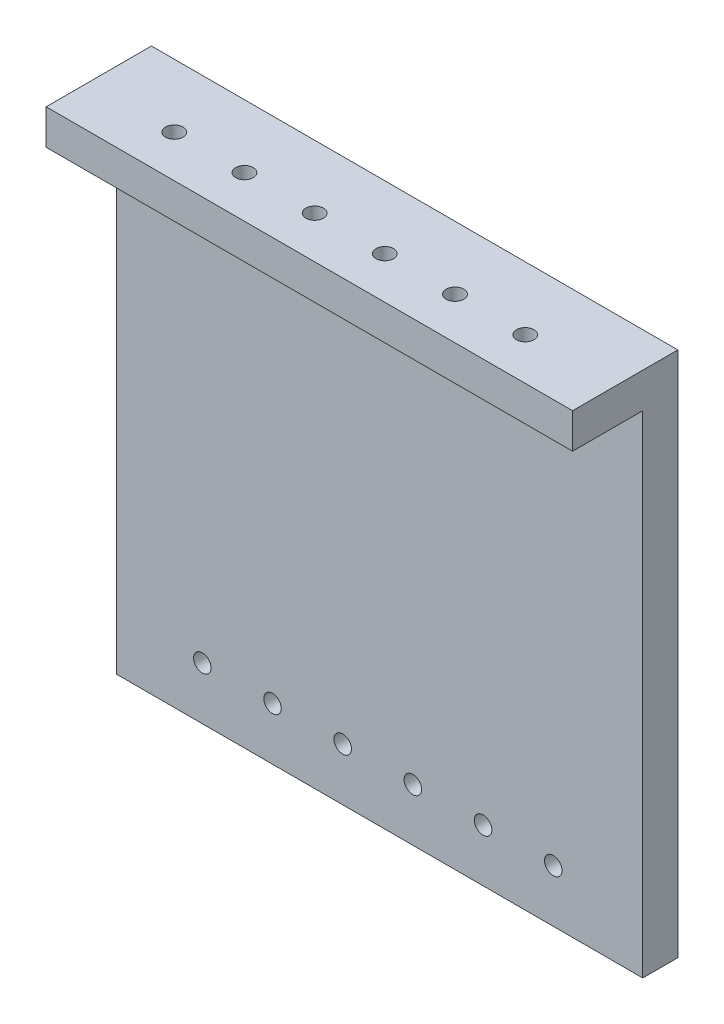
ISO-10303-21;
HEADER;
FILE_DESCRIPTION(('STEP AP214'),'2;1');
FILE_NAME('part.step','',(''),(''),'','','');
FILE_SCHEMA(('AUTOMOTIVE_DESIGN { 1 0 10303 214 1 1 1 1 }'));
ENDSEC;
DATA;
#1=APPLICATION_CONTEXT('core data for automotive mechanical design processes');
#2=APPLICATION_PROTOCOL_DEFINITION('international standard','automotive_design',2000,#1);
#3=PRODUCT_CONTEXT('',#1,'mechanical');
#4=PRODUCT('Part','Part','',(#3));
#5=PRODUCT_RELATED_PRODUCT_CATEGORY('part','',(#4));
#6=PRODUCT_DEFINITION_FORMATION('','',#4);
#7=PRODUCT_DEFINITION_CONTEXT('part definition',#1,'design');
#8=PRODUCT_DEFINITION('design','',#6,#7);
#9=PRODUCT_DEFINITION_SHAPE('','',#8);
#10=(LENGTH_UNIT() NAMED_UNIT(*) SI_UNIT(.MILLI.,.METRE.));
#11=(NAMED_UNIT(*) PLANE_ANGLE_UNIT() SI_UNIT($,.RADIAN.));
#12=(NAMED_UNIT(*) SI_UNIT($,.STERADIAN.) SOLID_ANGLE_UNIT());
#13=UNCERTAINTY_MEASURE_WITH_UNIT(LENGTH_MEASURE(1.E-05),#10,'distance_accuracy_value','');
#14=(GEOMETRIC_REPRESENTATION_CONTEXT(3) GLOBAL_UNCERTAINTY_ASSIGNED_CONTEXT((#13)) GLOBAL_UNIT_ASSIGNED_CONTEXT((#10,
#11,#12)) REPRESENTATION_CONTEXT('',''));
#15=CARTESIAN_POINT('',(0.,0.,0.));
#16=DIRECTION('',(0.,0.,1.));
#17=DIRECTION('',(1.,0.,0.));
#18=AXIS2_PLACEMENT_3D('',#15,#16,#17);
#19=CARTESIAN_POINT('',(0.,0.,5.));
#20=DIRECTION('',(0.,0.,-1.));
#21=DIRECTION('',(-1.,0.,0.));
#22=AXIS2_PLACEMENT_3D('',#19,#20,#21);
#23=PLANE('',#22);
#24=CARTESIAN_POINT('',(24.75,-30.,5.));
#25=DIRECTION('',(0.,0.,1.));
#26=DIRECTION('',(1.,0.,0.));
#27=AXIS2_PLACEMENT_3D('',#24,#25,#26);
#28=CIRCLE('',#27,1.25);
#29=CARTESIAN_POINT('',(26.,-30.,5.));
#30=VERTEX_POINT('',#29);
#31=EDGE_CURVE('E140',#30,#30,#28,.T.);
#32=ORIENTED_EDGE('',*,*,#31,.F.);
#33=EDGE_LOOP('',(#32));
#34=FACE_BOUND('',#33,.T.);
#35=CARTESIAN_POINT('',(14.75,-30.,5.));
#36=DIRECTION('',(0.,0.,1.));
#37=DIRECTION('',(1.,0.,0.));
#38=AXIS2_PLACEMENT_3D('',#35,#36,#37);
#39=CIRCLE('',#38,1.25);
#40=CARTESIAN_POINT('',(16.,-30.,5.));
#41=VERTEX_POINT('',#40);
#42=EDGE_CURVE('E146',#41,#41,#39,.T.);
#43=ORIENTED_EDGE('',*,*,#42,.F.);
#44=EDGE_LOOP('',(#43));
#45=FACE_BOUND('',#44,.T.);
#46=CARTESIAN_POINT('',(4.75000000000001,-30.,5.));
#47=DIRECTION('',(0.,0.,1.));
#48=DIRECTION('',(1.,0.,0.));
#49=AXIS2_PLACEMENT_3D('',#46,#47,#48);
#50=CIRCLE('',#49,1.25);
#51=CARTESIAN_POINT('',(6.00000000000001,-30.,5.));
#52=VERTEX_POINT('',#51);
#53=EDGE_CURVE('E152',#52,#52,#50,.T.);
#54=ORIENTED_EDGE('',*,*,#53,.F.);
#55=EDGE_LOOP('',(#54));
#56=FACE_BOUND('',#55,.T.);
#57=CARTESIAN_POINT('',(-5.24999999999999,-30.,5.));
#58=DIRECTION('',(0.,0.,1.));
#59=DIRECTION('',(1.,0.,0.));
#60=AXIS2_PLACEMENT_3D('',#57,#58,#59);
#61=CIRCLE('',#60,1.25);
#62=CARTESIAN_POINT('',(-3.99999999999999,-30.,5.));
#63=VERTEX_POINT('',#62);
#64=EDGE_CURVE('E158',#63,#63,#61,.T.);
#65=ORIENTED_EDGE('',*,*,#64,.F.);
#66=EDGE_LOOP('',(#65));
#67=FACE_BOUND('',#66,.T.);
#68=CARTESIAN_POINT('',(-15.25,-30.,5.));
#69=DIRECTION('',(0.,0.,1.));
#70=DIRECTION('',(1.,0.,0.));
#71=AXIS2_PLACEMENT_3D('',#68,#69,#70);
#72=CIRCLE('',#71,1.25);
#73=CARTESIAN_POINT('',(-14.,-30.,5.));
#74=VERTEX_POINT('',#73);
#75=EDGE_CURVE('E164',#74,#74,#72,.T.);
#76=ORIENTED_EDGE('',*,*,#75,.F.);
#77=EDGE_LOOP('',(#76));
#78=FACE_BOUND('',#77,.T.);
#79=CARTESIAN_POINT('',(-25.25,-30.,5.));
#80=DIRECTION('',(0.,0.,1.));
#81=DIRECTION('',(1.,0.,0.));
#82=AXIS2_PLACEMENT_3D('',#79,#80,#81);
#83=CIRCLE('',#82,1.25);
#84=CARTESIAN_POINT('',(-24.,-30.,5.));
#85=VERTEX_POINT('',#84);
#86=EDGE_CURVE('E95',#85,#85,#83,.T.);
#87=ORIENTED_EDGE('',*,*,#86,.F.);
#88=EDGE_LOOP('',(#87));
#89=FACE_BOUND('',#88,.T.);
#90=DIRECTION('',(1.,0.,0.));
#91=VECTOR('',#90,1.);
#92=CARTESIAN_POINT('',(-37.5,32.5,5.));
#93=LINE('',#92,#91);
#94=CARTESIAN_POINT('',(-37.5,32.5,5.));
#95=VERTEX_POINT('',#94);
#96=CARTESIAN_POINT('',(37.5,32.5,5.));
#97=VERTEX_POINT('',#96);
#98=EDGE_CURVE('E48',#95,#97,#93,.T.);
#99=ORIENTED_EDGE('',*,*,#98,.F.);
#100=DIRECTION('',(0.,-1.,0.));
#101=VECTOR('',#100,1.);
#102=CARTESIAN_POINT('',(-37.5,-37.5,5.));
#103=LINE('',#102,#101);
#104=CARTESIAN_POINT('',(-37.5,-37.5,5.));
#105=VERTEX_POINT('',#104);
#106=EDGE_CURVE('E171',#95,#105,#103,.T.);
#107=ORIENTED_EDGE('',*,*,#106,.T.);
#108=DIRECTION('',(1.,0.,0.));
#109=VECTOR('',#108,1.);
#110=CARTESIAN_POINT('',(-37.5,-37.5,5.));
#111=LINE('',#110,#109);
#112=CARTESIAN_POINT('',(37.5,-37.5,5.));
#113=VERTEX_POINT('',#112);
#114=EDGE_CURVE('E54',#105,#113,#111,.T.);
#115=ORIENTED_EDGE('',*,*,#114,.T.);
#116=DIRECTION('',(0.,1.,0.));
#117=VECTOR('',#116,1.);
#118=CARTESIAN_POINT('',(37.5,-37.5,5.));
#119=LINE('',#118,#117);
#120=EDGE_CURVE('E83',#113,#97,#119,.T.);
#121=ORIENTED_EDGE('',*,*,#120,.T.);
#122=EDGE_LOOP('',(#99,#107,#115,#121));
#123=FACE_BOUND('',#122,.T.);
#124=ADVANCED_FACE('F33',(#34,#45,#56,#67,#78,#89,#123),#23,.F.);
#125=CARTESIAN_POINT('',(0.,0.,0.));
#126=DIRECTION('',(0.,0.,-1.));
#127=DIRECTION('',(-1.,0.,0.));
#128=AXIS2_PLACEMENT_3D('',#125,#126,#127);
#129=PLANE('',#128);
#130=CARTESIAN_POINT('',(14.75,-30.,0.));
#131=DIRECTION('',(0.,0.,1.));
#132=DIRECTION('',(1.,0.,0.));
#133=AXIS2_PLACEMENT_3D('',#130,#131,#132);
#134=CIRCLE('',#133,1.25);
#135=CARTESIAN_POINT('',(16.,-30.,0.));
#136=VERTEX_POINT('',#135);
#137=EDGE_CURVE('E143',#136,#136,#134,.T.);
#138=ORIENTED_EDGE('',*,*,#137,.T.);
#139=EDGE_LOOP('',(#138));
#140=FACE_BOUND('',#139,.T.);
#141=CARTESIAN_POINT('',(-5.24999999999999,-30.,0.));
#142=DIRECTION('',(0.,0.,1.));
#143=DIRECTION('',(1.,0.,0.));
#144=AXIS2_PLACEMENT_3D('',#141,#142,#143);
#145=CIRCLE('',#144,1.25);
#146=CARTESIAN_POINT('',(-3.99999999999999,-30.,0.));
#147=VERTEX_POINT('',#146);
#148=EDGE_CURVE('E155',#147,#147,#145,.T.);
#149=ORIENTED_EDGE('',*,*,#148,.T.);
#150=EDGE_LOOP('',(#149));
#151=FACE_BOUND('',#150,.T.);
#152=CARTESIAN_POINT('',(-25.25,-30.,0.));
#153=DIRECTION('',(0.,0.,1.));
#154=DIRECTION('',(1.,0.,0.));
#155=AXIS2_PLACEMENT_3D('',#152,#153,#154);
#156=CIRCLE('',#155,1.25);
#157=CARTESIAN_POINT('',(-24.,-30.,0.));
#158=VERTEX_POINT('',#157);
#159=EDGE_CURVE('E99',#158,#158,#156,.T.);
#160=ORIENTED_EDGE('',*,*,#159,.T.);
#161=EDGE_LOOP('',(#160));
#162=FACE_BOUND('',#161,.T.);
#163=DIRECTION('',(0.,1.,0.));
#164=VECTOR('',#163,1.);
#165=CARTESIAN_POINT('',(37.5,-37.5,0.));
#166=LINE('',#165,#164);
#167=CARTESIAN_POINT('',(37.5,-37.5,0.));
#168=VERTEX_POINT('',#167);
#169=CARTESIAN_POINT('',(37.5,37.5,0.));
#170=VERTEX_POINT('',#169);
#171=EDGE_CURVE('E89',#168,#170,#166,.T.);
#172=ORIENTED_EDGE('',*,*,#171,.F.);
#173=DIRECTION('',(1.,0.,0.));
#174=VECTOR('',#173,1.);
#175=CARTESIAN_POINT('',(-37.5,-37.5,0.));
#176=LINE('',#175,#174);
#177=CARTESIAN_POINT('',(-37.5,-37.5,0.));
#178=VERTEX_POINT('',#177);
#179=EDGE_CURVE('E73',#178,#168,#176,.T.);
#180=ORIENTED_EDGE('',*,*,#179,.F.);
#181=DIRECTION('',(0.,-1.,0.));
#182=VECTOR('',#181,1.);
#183=CARTESIAN_POINT('',(-37.5,-37.5,0.));
#184=LINE('',#183,#182);
#185=CARTESIAN_POINT('',(-37.5,37.5,0.));
#186=VERTEX_POINT('',#185);
#187=EDGE_CURVE('E84',#186,#178,#184,.T.);
#188=ORIENTED_EDGE('',*,*,#187,.F.);
#189=DIRECTION('',(-1.,0.,0.));
#190=VECTOR('',#189,1.);
#191=CARTESIAN_POINT('',(-37.5,37.5,0.));
#192=LINE('',#191,#190);
#193=EDGE_CURVE('E94',#170,#186,#192,.T.);
#194=ORIENTED_EDGE('',*,*,#193,.F.);
#195=EDGE_LOOP('',(#172,#180,#188,#194));
#196=FACE_BOUND('',#195,.T.);
#197=CARTESIAN_POINT('',(-15.25,-30.,0.));
#198=DIRECTION('',(0.,0.,1.));
#199=DIRECTION('',(1.,0.,0.));
#200=AXIS2_PLACEMENT_3D('',#197,#198,#199);
#201=CIRCLE('',#200,1.25);
#202=CARTESIAN_POINT('',(-14.,-30.,0.));
#203=VERTEX_POINT('',#202);
#204=EDGE_CURVE('E161',#203,#203,#201,.T.);
#205=ORIENTED_EDGE('',*,*,#204,.T.);
#206=EDGE_LOOP('',(#205));
#207=FACE_BOUND('',#206,.T.);
#208=CARTESIAN_POINT('',(4.75000000000001,-30.,0.));
#209=DIRECTION('',(0.,0.,1.));
#210=DIRECTION('',(1.,0.,0.));
#211=AXIS2_PLACEMENT_3D('',#208,#209,#210);
#212=CIRCLE('',#211,1.25);
#213=CARTESIAN_POINT('',(6.00000000000001,-30.,0.));
#214=VERTEX_POINT('',#213);
#215=EDGE_CURVE('E149',#214,#214,#212,.T.);
#216=ORIENTED_EDGE('',*,*,#215,.T.);
#217=EDGE_LOOP('',(#216));
#218=FACE_BOUND('',#217,.T.);
#219=CARTESIAN_POINT('',(24.75,-30.,0.));
#220=DIRECTION('',(0.,0.,1.));
#221=DIRECTION('',(1.,0.,0.));
#222=AXIS2_PLACEMENT_3D('',#219,#220,#221);
#223=CIRCLE('',#222,1.25);
#224=CARTESIAN_POINT('',(26.,-30.,0.));
#225=VERTEX_POINT('',#224);
#226=EDGE_CURVE('E139',#225,#225,#223,.T.);
#227=ORIENTED_EDGE('',*,*,#226,.T.);
#228=EDGE_LOOP('',(#227));
#229=FACE_BOUND('',#228,.T.);
#230=ADVANCED_FACE('F92',(#140,#151,#162,#196,#207,#218,#229),#129,.T.);
#231=CARTESIAN_POINT('',(37.5,-37.5,5.));
#232=DIRECTION('',(-1.,0.,0.));
#233=DIRECTION('',(0.,0.,1.));
#234=AXIS2_PLACEMENT_3D('',#231,#232,#233);
#235=PLANE('',#234);
#236=ORIENTED_EDGE('',*,*,#171,.T.);
#237=DIRECTION('',(0.,0.,-1.));
#238=VECTOR('',#237,1.);
#239=CARTESIAN_POINT('',(37.5,37.5,5.));
#240=LINE('',#239,#238);
#241=CARTESIAN_POINT('',(37.5,37.5,15.));
#242=VERTEX_POINT('',#241);
#243=EDGE_CURVE('E11',#242,#170,#240,.T.);
#244=ORIENTED_EDGE('',*,*,#243,.F.);
#245=DIRECTION('',(0.,1.,0.));
#246=VECTOR('',#245,1.);
#247=CARTESIAN_POINT('',(37.5,37.5,15.));
#248=LINE('',#247,#246);
#249=CARTESIAN_POINT('',(37.5,32.5,15.));
#250=VERTEX_POINT('',#249);
#251=EDGE_CURVE('E126',#250,#242,#248,.T.);
#252=ORIENTED_EDGE('',*,*,#251,.F.);
#253=DIRECTION('',(0.,0.,-1.));
#254=VECTOR('',#253,1.);
#255=CARTESIAN_POINT('',(37.5,32.5,15.));
#256=LINE('',#255,#254);
#257=EDGE_CURVE('E127',#250,#97,#256,.T.);
#258=ORIENTED_EDGE('',*,*,#257,.T.);
#259=ORIENTED_EDGE('',*,*,#120,.F.);
#260=DIRECTION('',(0.,0.,-1.));
#261=VECTOR('',#260,1.);
#262=CARTESIAN_POINT('',(37.5,-37.5,5.));
#263=LINE('',#262,#261);
#264=EDGE_CURVE('E76',#113,#168,#263,.T.);
#265=ORIENTED_EDGE('',*,*,#264,.T.);
#266=EDGE_LOOP('',(#236,#244,#252,#258,#259,#265));
#267=FACE_BOUND('',#266,.T.);
#268=ADVANCED_FACE('F35',(#267),#235,.F.);
#269=CARTESIAN_POINT('',(-37.5,37.5,5.));
#270=DIRECTION('',(0.,-1.,0.));
#271=DIRECTION('',(0.,0.,-1.));
#272=AXIS2_PLACEMENT_3D('',#269,#270,#271);
#273=PLANE('',#272);
#274=CARTESIAN_POINT('',(-25.25,37.5,9.));
#275=DIRECTION('',(0.,1.,0.));
#276=DIRECTION('',(0.,0.,1.));
#277=AXIS2_PLACEMENT_3D('',#274,#275,#276);
#278=CIRCLE('',#277,1.25);
#279=CARTESIAN_POINT('',(-25.25,37.5,10.25));
#280=VERTEX_POINT('',#279);
#281=EDGE_CURVE('E209',#280,#280,#278,.T.);
#282=ORIENTED_EDGE('',*,*,#281,.F.);
#283=EDGE_LOOP('',(#282));
#284=FACE_BOUND('',#283,.T.);
#285=CARTESIAN_POINT('',(-15.25,37.5,9.));
#286=DIRECTION('',(0.,1.,0.));
#287=DIRECTION('',(0.,0.,1.));
#288=AXIS2_PLACEMENT_3D('',#285,#286,#287);
#289=CIRCLE('',#288,1.25);
#290=CARTESIAN_POINT('',(-15.25,37.5,10.25));
#291=VERTEX_POINT('',#290);
#292=EDGE_CURVE('E203',#291,#291,#289,.T.);
#293=ORIENTED_EDGE('',*,*,#292,.F.);
#294=EDGE_LOOP('',(#293));
#295=FACE_BOUND('',#294,.T.);
#296=CARTESIAN_POINT('',(-5.24999999999999,37.5,9.));
#297=DIRECTION('',(0.,1.,0.));
#298=DIRECTION('',(0.,0.,1.));
#299=AXIS2_PLACEMENT_3D('',#296,#297,#298);
#300=CIRCLE('',#299,1.25);
#301=CARTESIAN_POINT('',(-5.24999999999999,37.5,10.25));
#302=VERTEX_POINT('',#301);
#303=EDGE_CURVE('E197',#302,#302,#300,.T.);
#304=ORIENTED_EDGE('',*,*,#303,.F.);
#305=EDGE_LOOP('',(#304));
#306=FACE_BOUND('',#305,.T.);
#307=CARTESIAN_POINT('',(4.75000000000001,37.5,9.));
#308=DIRECTION('',(0.,1.,0.));
#309=DIRECTION('',(0.,0.,1.));
#310=AXIS2_PLACEMENT_3D('',#307,#308,#309);
#311=CIRCLE('',#310,1.25);
#312=CARTESIAN_POINT('',(4.75000000000001,37.5,10.25));
#313=VERTEX_POINT('',#312);
#314=EDGE_CURVE('E191',#313,#313,#311,.T.);
#315=ORIENTED_EDGE('',*,*,#314,.F.);
#316=EDGE_LOOP('',(#315));
#317=FACE_BOUND('',#316,.T.);
#318=CARTESIAN_POINT('',(14.75,37.5,9.));
#319=DIRECTION('',(0.,1.,0.));
#320=DIRECTION('',(0.,0.,1.));
#321=AXIS2_PLACEMENT_3D('',#318,#319,#320);
#322=CIRCLE('',#321,1.25);
#323=CARTESIAN_POINT('',(14.75,37.5,10.25));
#324=VERTEX_POINT('',#323);
#325=EDGE_CURVE('E184',#324,#324,#322,.T.);
#326=ORIENTED_EDGE('',*,*,#325,.F.);
#327=EDGE_LOOP('',(#326));
#328=FACE_BOUND('',#327,.T.);
#329=CARTESIAN_POINT('',(24.75,37.5,9.));
#330=DIRECTION('',(0.,1.,0.));
#331=DIRECTION('',(0.,0.,1.));
#332=AXIS2_PLACEMENT_3D('',#329,#330,#331);
#333=CIRCLE('',#332,1.25);
#334=CARTESIAN_POINT('',(24.75,37.5,10.25));
#335=VERTEX_POINT('',#334);
#336=EDGE_CURVE('E185',#335,#335,#333,.T.);
#337=ORIENTED_EDGE('',*,*,#336,.F.);
#338=EDGE_LOOP('',(#337));
#339=FACE_BOUND('',#338,.T.);
#340=ORIENTED_EDGE('',*,*,#193,.T.);
#341=DIRECTION('',(0.,0.,-1.));
#342=VECTOR('',#341,1.);
#343=CARTESIAN_POINT('',(-37.5,37.5,5.));
#344=LINE('',#343,#342);
#345=CARTESIAN_POINT('',(-37.5,37.5,15.));
#346=VERTEX_POINT('',#345);
#347=EDGE_CURVE('E41',#346,#186,#344,.T.);
#348=ORIENTED_EDGE('',*,*,#347,.F.);
#349=DIRECTION('',(-1.,0.,0.));
#350=VECTOR('',#349,1.);
#351=CARTESIAN_POINT('',(-37.5,37.5,15.));
#352=LINE('',#351,#350);
#353=EDGE_CURVE('E118',#242,#346,#352,.T.);
#354=ORIENTED_EDGE('',*,*,#353,.F.);
#355=ORIENTED_EDGE('',*,*,#243,.T.);
#356=EDGE_LOOP('',(#340,#348,#354,#355));
#357=FACE_BOUND('',#356,.T.);
#358=ADVANCED_FACE('F116',(#284,#295,#306,#317,#328,#339,#357),#273,.F.);
#359=CARTESIAN_POINT('',(-37.5,-37.5,5.));
#360=DIRECTION('',(1.,0.,0.));
#361=DIRECTION('',(0.,0.,-1.));
#362=AXIS2_PLACEMENT_3D('',#359,#360,#361);
#363=PLANE('',#362);
#364=ORIENTED_EDGE('',*,*,#187,.T.);
#365=DIRECTION('',(0.,0.,-1.));
#366=VECTOR('',#365,1.);
#367=CARTESIAN_POINT('',(-37.5,-37.5,5.));
#368=LINE('',#367,#366);
#369=EDGE_CURVE('E79',#105,#178,#368,.T.);
#370=ORIENTED_EDGE('',*,*,#369,.F.);
#371=ORIENTED_EDGE('',*,*,#106,.F.);
#372=DIRECTION('',(0.,0.,-1.));
#373=VECTOR('',#372,1.);
#374=CARTESIAN_POINT('',(-37.5,32.5,15.));
#375=LINE('',#374,#373);
#376=CARTESIAN_POINT('',(-37.5,32.5,15.));
#377=VERTEX_POINT('',#376);
#378=EDGE_CURVE('E129',#377,#95,#375,.T.);
#379=ORIENTED_EDGE('',*,*,#378,.F.);
#380=DIRECTION('',(0.,-1.,0.));
#381=VECTOR('',#380,1.);
#382=CARTESIAN_POINT('',(-37.5,37.5,15.));
#383=LINE('',#382,#381);
#384=EDGE_CURVE('E112',#346,#377,#383,.T.);
#385=ORIENTED_EDGE('',*,*,#384,.F.);
#386=ORIENTED_EDGE('',*,*,#347,.T.);
#387=EDGE_LOOP('',(#364,#370,#371,#379,#385,#386));
#388=FACE_BOUND('',#387,.T.);
#389=ADVANCED_FACE('F109',(#388),#363,.F.);
#390=CARTESIAN_POINT('',(-37.5,-37.5,5.));
#391=DIRECTION('',(0.,1.,0.));
#392=DIRECTION('',(0.,0.,1.));
#393=AXIS2_PLACEMENT_3D('',#390,#391,#392);
#394=PLANE('',#393);
#395=ORIENTED_EDGE('',*,*,#179,.T.);
#396=ORIENTED_EDGE('',*,*,#264,.F.);
#397=ORIENTED_EDGE('',*,*,#114,.F.);
#398=ORIENTED_EDGE('',*,*,#369,.T.);
#399=EDGE_LOOP('',(#395,#396,#397,#398));
#400=FACE_BOUND('',#399,.T.);
#401=ADVANCED_FACE('F75',(#400),#394,.F.);
#402=CARTESIAN_POINT('',(-25.25,-30.,5.));
#403=DIRECTION('',(0.,0.,-1.));
#404=DIRECTION('',(-1.,0.,0.));
#405=AXIS2_PLACEMENT_3D('',#402,#403,#404);
#406=CYLINDRICAL_SURFACE('',#405,1.25);
#407=ORIENTED_EDGE('',*,*,#86,.T.);
#408=EDGE_LOOP('',(#407));
#409=FACE_BOUND('',#408,.T.);
#410=ORIENTED_EDGE('',*,*,#159,.F.);
#411=EDGE_LOOP('',(#410));
#412=FACE_BOUND('',#411,.T.);
#413=ADVANCED_FACE('F264',(#409,#412),#406,.F.);
#414=CARTESIAN_POINT('',(-15.25,-30.,5.));
#415=DIRECTION('',(0.,0.,-1.));
#416=DIRECTION('',(-1.,0.,0.));
#417=AXIS2_PLACEMENT_3D('',#414,#415,#416);
#418=CYLINDRICAL_SURFACE('',#417,1.25);
#419=ORIENTED_EDGE('',*,*,#75,.T.);
#420=EDGE_LOOP('',(#419));
#421=FACE_BOUND('',#420,.T.);
#422=ORIENTED_EDGE('',*,*,#204,.F.);
#423=EDGE_LOOP('',(#422));
#424=FACE_BOUND('',#423,.T.);
#425=ADVANCED_FACE('F288',(#421,#424),#418,.F.);
#426=CARTESIAN_POINT('',(-5.24999999999999,-30.,5.));
#427=DIRECTION('',(0.,0.,-1.));
#428=DIRECTION('',(-1.,0.,0.));
#429=AXIS2_PLACEMENT_3D('',#426,#427,#428);
#430=CYLINDRICAL_SURFACE('',#429,1.25);
#431=ORIENTED_EDGE('',*,*,#64,.T.);
#432=EDGE_LOOP('',(#431));
#433=FACE_BOUND('',#432,.T.);
#434=ORIENTED_EDGE('',*,*,#148,.F.);
#435=EDGE_LOOP('',(#434));
#436=FACE_BOUND('',#435,.T.);
#437=ADVANCED_FACE('F295',(#433,#436),#430,.F.);
#438=CARTESIAN_POINT('',(4.75000000000001,-30.,5.));
#439=DIRECTION('',(0.,0.,-1.));
#440=DIRECTION('',(-1.,0.,0.));
#441=AXIS2_PLACEMENT_3D('',#438,#439,#440);
#442=CYLINDRICAL_SURFACE('',#441,1.25);
#443=ORIENTED_EDGE('',*,*,#53,.T.);
#444=EDGE_LOOP('',(#443));
#445=FACE_BOUND('',#444,.T.);
#446=ORIENTED_EDGE('',*,*,#215,.F.);
#447=EDGE_LOOP('',(#446));
#448=FACE_BOUND('',#447,.T.);
#449=ADVANCED_FACE('F302',(#445,#448),#442,.F.);
#450=CARTESIAN_POINT('',(14.75,-30.,5.));
#451=DIRECTION('',(0.,0.,-1.));
#452=DIRECTION('',(-1.,0.,0.));
#453=AXIS2_PLACEMENT_3D('',#450,#451,#452);
#454=CYLINDRICAL_SURFACE('',#453,1.25);
#455=ORIENTED_EDGE('',*,*,#42,.T.);
#456=EDGE_LOOP('',(#455));
#457=FACE_BOUND('',#456,.T.);
#458=ORIENTED_EDGE('',*,*,#137,.F.);
#459=EDGE_LOOP('',(#458));
#460=FACE_BOUND('',#459,.T.);
#461=ADVANCED_FACE('F248',(#457,#460),#454,.F.);
#462=CARTESIAN_POINT('',(24.75,-30.,5.));
#463=DIRECTION('',(0.,0.,-1.));
#464=DIRECTION('',(-1.,0.,0.));
#465=AXIS2_PLACEMENT_3D('',#462,#463,#464);
#466=CYLINDRICAL_SURFACE('',#465,1.25);
#467=ORIENTED_EDGE('',*,*,#31,.T.);
#468=EDGE_LOOP('',(#467));
#469=FACE_BOUND('',#468,.T.);
#470=ORIENTED_EDGE('',*,*,#226,.F.);
#471=EDGE_LOOP('',(#470));
#472=FACE_BOUND('',#471,.T.);
#473=ADVANCED_FACE('F240',(#469,#472),#466,.F.);
#474=CARTESIAN_POINT('',(-37.5,32.5,15.));
#475=DIRECTION('',(0.,1.,0.));
#476=DIRECTION('',(-1.,0.,0.));
#477=AXIS2_PLACEMENT_3D('',#474,#475,#476);
#478=PLANE('',#477);
#479=CARTESIAN_POINT('',(-25.25,32.5,9.));
#480=DIRECTION('',(0.,1.,0.));
#481=DIRECTION('',(-1.,0.,0.));
#482=AXIS2_PLACEMENT_3D('',#479,#480,#481);
#483=CIRCLE('',#482,1.25);
#484=CARTESIAN_POINT('',(-26.5,32.5,9.));
#485=VERTEX_POINT('',#484);
#486=EDGE_CURVE('E135',#485,#485,#483,.F.);
#487=ORIENTED_EDGE('',*,*,#486,.F.);
#488=EDGE_LOOP('',(#487));
#489=FACE_BOUND('',#488,.T.);
#490=CARTESIAN_POINT('',(-15.25,32.5,9.));
#491=DIRECTION('',(0.,1.,0.));
#492=DIRECTION('',(-1.,0.,0.));
#493=AXIS2_PLACEMENT_3D('',#490,#491,#492);
#494=CIRCLE('',#493,1.25);
#495=CARTESIAN_POINT('',(-16.5,32.5,9.));
#496=VERTEX_POINT('',#495);
#497=EDGE_CURVE('E206',#496,#496,#494,.F.);
#498=ORIENTED_EDGE('',*,*,#497,.F.);
#499=EDGE_LOOP('',(#498));
#500=FACE_BOUND('',#499,.T.);
#501=CARTESIAN_POINT('',(-5.24999999999999,32.5,9.));
#502=DIRECTION('',(0.,1.,0.));
#503=DIRECTION('',(-1.,0.,0.));
#504=AXIS2_PLACEMENT_3D('',#501,#502,#503);
#505=CIRCLE('',#504,1.25);
#506=CARTESIAN_POINT('',(-6.49999999999999,32.5,9.));
#507=VERTEX_POINT('',#506);
#508=EDGE_CURVE('E200',#507,#507,#505,.F.);
#509=ORIENTED_EDGE('',*,*,#508,.F.);
#510=EDGE_LOOP('',(#509));
#511=FACE_BOUND('',#510,.T.);
#512=CARTESIAN_POINT('',(4.75000000000001,32.5,9.));
#513=DIRECTION('',(0.,1.,0.));
#514=DIRECTION('',(-1.,0.,0.));
#515=AXIS2_PLACEMENT_3D('',#512,#513,#514);
#516=CIRCLE('',#515,1.25);
#517=CARTESIAN_POINT('',(3.50000000000001,32.5,9.));
#518=VERTEX_POINT('',#517);
#519=EDGE_CURVE('E194',#518,#518,#516,.F.);
#520=ORIENTED_EDGE('',*,*,#519,.F.);
#521=EDGE_LOOP('',(#520));
#522=FACE_BOUND('',#521,.T.);
#523=CARTESIAN_POINT('',(14.75,32.5,9.));
#524=DIRECTION('',(0.,1.,0.));
#525=DIRECTION('',(-1.,0.,0.));
#526=AXIS2_PLACEMENT_3D('',#523,#524,#525);
#527=CIRCLE('',#526,1.25);
#528=CARTESIAN_POINT('',(13.5,32.5,9.));
#529=VERTEX_POINT('',#528);
#530=EDGE_CURVE('E188',#529,#529,#527,.F.);
#531=ORIENTED_EDGE('',*,*,#530,.F.);
#532=EDGE_LOOP('',(#531));
#533=FACE_BOUND('',#532,.T.);
#534=CARTESIAN_POINT('',(24.75,32.5,9.));
#535=DIRECTION('',(0.,1.,0.));
#536=DIRECTION('',(-1.,0.,0.));
#537=AXIS2_PLACEMENT_3D('',#534,#535,#536);
#538=CIRCLE('',#537,1.25);
#539=CARTESIAN_POINT('',(23.5,32.5,9.));
#540=VERTEX_POINT('',#539);
#541=EDGE_CURVE('E181',#540,#540,#538,.F.);
#542=ORIENTED_EDGE('',*,*,#541,.F.);
#543=EDGE_LOOP('',(#542));
#544=FACE_BOUND('',#543,.T.);
#545=ORIENTED_EDGE('',*,*,#98,.T.);
#546=ORIENTED_EDGE('',*,*,#257,.F.);
#547=DIRECTION('',(1.,0.,0.));
#548=VECTOR('',#547,1.);
#549=CARTESIAN_POINT('',(-37.5,32.5,15.));
#550=LINE('',#549,#548);
#551=EDGE_CURVE('E131',#377,#250,#550,.T.);
#552=ORIENTED_EDGE('',*,*,#551,.F.);
#553=ORIENTED_EDGE('',*,*,#378,.T.);
#554=EDGE_LOOP('',(#545,#546,#552,#553));
#555=FACE_BOUND('',#554,.T.);
#556=ADVANCED_FACE('F174',(#489,#500,#511,#522,#533,#544,#555),#478,.F.);
#557=CARTESIAN_POINT('',(0.,0.,15.));
#558=DIRECTION('',(0.,0.,1.));
#559=DIRECTION('',(1.,0.,0.));
#560=AXIS2_PLACEMENT_3D('',#557,#558,#559);
#561=PLANE('',#560);
#562=ORIENTED_EDGE('',*,*,#384,.T.);
#563=ORIENTED_EDGE('',*,*,#551,.T.);
#564=ORIENTED_EDGE('',*,*,#251,.T.);
#565=ORIENTED_EDGE('',*,*,#353,.T.);
#566=EDGE_LOOP('',(#562,#563,#564,#565));
#567=FACE_BOUND('',#566,.T.);
#568=ADVANCED_FACE('F122',(#567),#561,.T.);
#569=CARTESIAN_POINT('',(24.75,-37.501,9.));
#570=DIRECTION('',(0.,1.,0.));
#571=DIRECTION('',(0.,0.,1.));
#572=AXIS2_PLACEMENT_3D('',#569,#570,#571);
#573=CYLINDRICAL_SURFACE('',#572,1.25);
#574=ORIENTED_EDGE('',*,*,#336,.T.);
#575=EDGE_LOOP('',(#574));
#576=FACE_BOUND('',#575,.T.);
#577=ORIENTED_EDGE('',*,*,#541,.T.);
#578=EDGE_LOOP('',(#577));
#579=FACE_BOUND('',#578,.T.);
#580=ADVANCED_FACE('F232',(#576,#579),#573,.F.);
#581=CARTESIAN_POINT('',(14.75,-37.501,9.));
#582=DIRECTION('',(0.,1.,0.));
#583=DIRECTION('',(0.,0.,1.));
#584=AXIS2_PLACEMENT_3D('',#581,#582,#583);
#585=CYLINDRICAL_SURFACE('',#584,1.25);
#586=ORIENTED_EDGE('',*,*,#325,.T.);
#587=EDGE_LOOP('',(#586));
#588=FACE_BOUND('',#587,.T.);
#589=ORIENTED_EDGE('',*,*,#530,.T.);
#590=EDGE_LOOP('',(#589));
#591=FACE_BOUND('',#590,.T.);
#592=ADVANCED_FACE('F235',(#588,#591),#585,.F.);
#593=CARTESIAN_POINT('',(4.75000000000001,-37.501,9.));
#594=DIRECTION('',(0.,1.,0.));
#595=DIRECTION('',(0.,0.,1.));
#596=AXIS2_PLACEMENT_3D('',#593,#594,#595);
#597=CYLINDRICAL_SURFACE('',#596,1.25);
#598=ORIENTED_EDGE('',*,*,#314,.T.);
#599=EDGE_LOOP('',(#598));
#600=FACE_BOUND('',#599,.T.);
#601=ORIENTED_EDGE('',*,*,#519,.T.);
#602=EDGE_LOOP('',(#601));
#603=FACE_BOUND('',#602,.T.);
#604=ADVANCED_FACE('F385',(#600,#603),#597,.F.);
#605=CARTESIAN_POINT('',(-5.24999999999999,-37.501,9.));
#606=DIRECTION('',(0.,1.,0.));
#607=DIRECTION('',(0.,0.,1.));
#608=AXIS2_PLACEMENT_3D('',#605,#606,#607);
#609=CYLINDRICAL_SURFACE('',#608,1.25);
#610=ORIENTED_EDGE('',*,*,#303,.T.);
#611=EDGE_LOOP('',(#610));
#612=FACE_BOUND('',#611,.T.);
#613=ORIENTED_EDGE('',*,*,#508,.T.);
#614=EDGE_LOOP('',(#613));
#615=FACE_BOUND('',#614,.T.);
#616=ADVANCED_FACE('F394',(#612,#615),#609,.F.);
#617=CARTESIAN_POINT('',(-15.25,-37.501,9.));
#618=DIRECTION('',(0.,1.,0.));
#619=DIRECTION('',(0.,0.,1.));
#620=AXIS2_PLACEMENT_3D('',#617,#618,#619);
#621=CYLINDRICAL_SURFACE('',#620,1.25);
#622=ORIENTED_EDGE('',*,*,#292,.T.);
#623=EDGE_LOOP('',(#622));
#624=FACE_BOUND('',#623,.T.);
#625=ORIENTED_EDGE('',*,*,#497,.T.);
#626=EDGE_LOOP('',(#625));
#627=FACE_BOUND('',#626,.T.);
#628=ADVANCED_FACE('F403',(#624,#627),#621,.F.);
#629=CARTESIAN_POINT('',(-25.25,-37.501,9.));
#630=DIRECTION('',(0.,1.,0.));
#631=DIRECTION('',(0.,0.,1.));
#632=AXIS2_PLACEMENT_3D('',#629,#630,#631);
#633=CYLINDRICAL_SURFACE('',#632,1.25);
#634=ORIENTED_EDGE('',*,*,#281,.T.);
#635=EDGE_LOOP('',(#634));
#636=FACE_BOUND('',#635,.T.);
#637=ORIENTED_EDGE('',*,*,#486,.T.);
#638=EDGE_LOOP('',(#637));
#639=FACE_BOUND('',#638,.T.);
#640=ADVANCED_FACE('F217',(#636,#639),#633,.F.);
#641=CLOSED_SHELL('',(#124,#230,#268,#358,#389,#401,#413,#425,#437,#449,#461,#473,#556,#568,
#580,#592,#604,#616,#628,#640));
#642=MANIFOLD_SOLID_BREP('B2',#641);
#643=ADVANCED_BREP_SHAPE_REPRESENTATION('',(#18,#642),#14);
#644=SHAPE_DEFINITION_REPRESENTATION(#9,#643);
ENDSEC;
END-ISO-10303-21;
